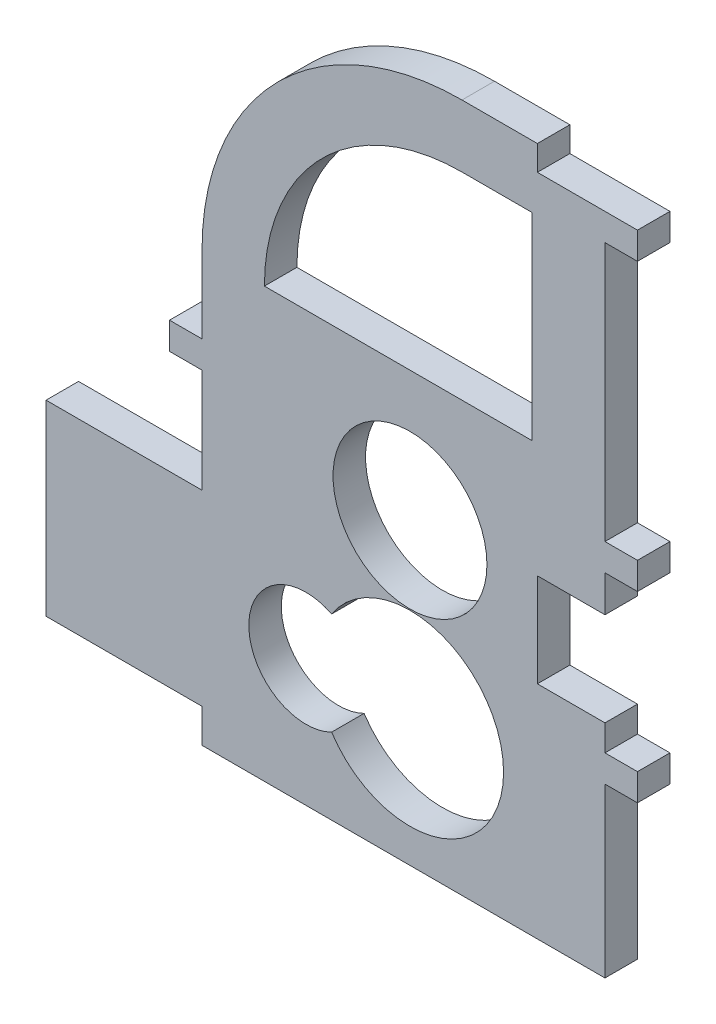
ISO-10303-21;
HEADER;
FILE_DESCRIPTION(('STEP AP214'),'2;1');
FILE_NAME('part.step','',(''),(''),'','','');
FILE_SCHEMA(('AUTOMOTIVE_DESIGN { 1 0 10303 214 1 1 1 1 }'));
ENDSEC;
DATA;
#1=APPLICATION_CONTEXT('core data for automotive mechanical design processes');
#2=APPLICATION_PROTOCOL_DEFINITION('international standard','automotive_design',2000,#1);
#3=PRODUCT_CONTEXT('',#1,'mechanical');
#4=PRODUCT('Part','Part','',(#3));
#5=PRODUCT_RELATED_PRODUCT_CATEGORY('part','',(#4));
#6=PRODUCT_DEFINITION_FORMATION('','',#4);
#7=PRODUCT_DEFINITION_CONTEXT('part definition',#1,'design');
#8=PRODUCT_DEFINITION('design','',#6,#7);
#9=PRODUCT_DEFINITION_SHAPE('','',#8);
#10=(LENGTH_UNIT() NAMED_UNIT(*) SI_UNIT(.MILLI.,.METRE.));
#11=(NAMED_UNIT(*) PLANE_ANGLE_UNIT() SI_UNIT($,.RADIAN.));
#12=(NAMED_UNIT(*) SI_UNIT($,.STERADIAN.) SOLID_ANGLE_UNIT());
#13=UNCERTAINTY_MEASURE_WITH_UNIT(LENGTH_MEASURE(1.E-05),#10,'distance_accuracy_value','');
#14=(GEOMETRIC_REPRESENTATION_CONTEXT(3) GLOBAL_UNCERTAINTY_ASSIGNED_CONTEXT((#13)) GLOBAL_UNIT_ASSIGNED_CONTEXT((#10,
#11,#12)) REPRESENTATION_CONTEXT('',''));
#15=CARTESIAN_POINT('',(0.,0.,0.));
#16=DIRECTION('',(0.,0.,1.));
#17=DIRECTION('',(1.,0.,0.));
#18=AXIS2_PLACEMENT_3D('',#15,#16,#17);
#19=CARTESIAN_POINT('',(0.,0.,1.5875));
#20=DIRECTION('',(0.,0.,1.));
#21=DIRECTION('',(1.,0.,0.));
#22=AXIS2_PLACEMENT_3D('',#19,#20,#21);
#23=PLANE('',#22);
#24=CARTESIAN_POINT('',(2.53999999958048,6.34999999999666,1.5875));
#25=DIRECTION('',(0.,0.,1.));
#26=DIRECTION('',(1.,0.,0.));
#27=AXIS2_PLACEMENT_3D('',#24,#25,#26);
#28=CIRCLE('',#27,9.652);
#29=CARTESIAN_POINT('',(2.53999999958048,16.0019999999967,1.5875));
#30=VERTEX_POINT('',#29);
#31=CARTESIAN_POINT('',(-7.11200000041952,6.34999999999666,1.5875));
#32=VERTEX_POINT('',#31);
#33=EDGE_CURVE('E340',#30,#32,#28,.T.);
#34=ORIENTED_EDGE('',*,*,#33,.F.);
#35=DIRECTION('',(-1.,0.,0.));
#36=VECTOR('',#35,1.);
#37=CARTESIAN_POINT('',(0.,16.0019999999967,1.5875));
#38=LINE('',#37,#36);
#39=CARTESIAN_POINT('',(5.96899999916794,16.0019999999967,1.5875));
#40=VERTEX_POINT('',#39);
#41=EDGE_CURVE('E337',#40,#30,#38,.T.);
#42=ORIENTED_EDGE('',*,*,#41,.F.);
#43=DIRECTION('',(0.,1.,0.));
#44=VECTOR('',#43,1.);
#45=CARTESIAN_POINT('',(5.96899999916794,0.,1.5875));
#46=LINE('',#45,#44);
#47=CARTESIAN_POINT('',(5.96899999916794,6.34999999999666,1.5875));
#48=VERTEX_POINT('',#47);
#49=EDGE_CURVE('E334',#48,#40,#46,.T.);
#50=ORIENTED_EDGE('',*,*,#49,.F.);
#51=DIRECTION('',(1.,0.,0.));
#52=VECTOR('',#51,1.);
#53=CARTESIAN_POINT('',(0.,6.34999999999666,1.5875));
#54=LINE('',#53,#52);
#55=EDGE_CURVE('E331',#32,#48,#54,.T.);
#56=ORIENTED_EDGE('',*,*,#55,.F.);
#57=EDGE_LOOP('',(#34,#42,#50,#56));
#58=FACE_BOUND('',#57,.T.);
#59=CARTESIAN_POINT('',(0.,0.,1.5875));
#60=DIRECTION('',(0.,0.,1.));
#61=DIRECTION('',(1.,0.,0.));
#62=AXIS2_PLACEMENT_3D('',#59,#60,#61);
#63=CIRCLE('',#62,3.7592);
#64=CARTESIAN_POINT('',(3.7592,0.,1.5875));
#65=VERTEX_POINT('',#64);
#66=EDGE_CURVE('E328',#65,#65,#63,.T.);
#67=ORIENTED_EDGE('',*,*,#66,.F.);
#68=EDGE_LOOP('',(#67));
#69=FACE_BOUND('',#68,.T.);
#70=CARTESIAN_POINT('',(-5.08,-8.382,1.5875));
#71=DIRECTION('',(0.,0.,1.));
#72=DIRECTION('',(1.,0.,0.));
#73=AXIS2_PLACEMENT_3D('',#70,#71,#72);
#74=CIRCLE('',#73,2.794);
#75=CARTESIAN_POINT('',(-3.82905,-5.88368855074072,1.5875));
#76=VERTEX_POINT('',#75);
#77=CARTESIAN_POINT('',(-3.82905,-10.8803114492593,1.5875));
#78=VERTEX_POINT('',#77);
#79=EDGE_CURVE('E325',#76,#78,#74,.T.);
#80=ORIENTED_EDGE('',*,*,#79,.F.);
#81=CARTESIAN_POINT('',(0.,-8.382,1.5875));
#82=DIRECTION('',(0.,0.,1.));
#83=DIRECTION('',(1.,0.,0.));
#84=AXIS2_PLACEMENT_3D('',#81,#82,#83);
#85=CIRCLE('',#84,4.572);
#86=EDGE_CURVE('E322',#78,#76,#85,.T.);
#87=ORIENTED_EDGE('',*,*,#86,.F.);
#88=EDGE_LOOP('',(#80,#87));
#89=FACE_BOUND('',#88,.T.);
#90=DIRECTION('',(1.,0.,0.));
#91=VECTOR('',#90,1.);
#92=CARTESIAN_POINT('',(0.,17.8308,1.5875));
#93=LINE('',#92,#91);
#94=CARTESIAN_POINT('',(6.222999999168,17.8308,1.5875));
#95=VERTEX_POINT('',#94);
#96=CARTESIAN_POINT('',(11.1124999991679,17.8308,1.5875));
#97=VERTEX_POINT('',#96);
#98=EDGE_CURVE('E408',#95,#97,#93,.T.);
#99=ORIENTED_EDGE('',*,*,#98,.F.);
#100=DIRECTION('',(0.,1.,0.));
#101=VECTOR('',#100,1.);
#102=CARTESIAN_POINT('',(6.22299999916801,0.,1.5875));
#103=LINE('',#102,#101);
#104=CARTESIAN_POINT('',(6.222999999168,19.0499999999967,1.5875));
#105=VERTEX_POINT('',#104);
#106=EDGE_CURVE('E374',#95,#105,#103,.T.);
#107=ORIENTED_EDGE('',*,*,#106,.T.);
#108=DIRECTION('',(1.,0.,0.));
#109=VECTOR('',#108,1.);
#110=CARTESIAN_POINT('',(0.,19.0499999999967,1.5875));
#111=LINE('',#110,#109);
#112=CARTESIAN_POINT('',(2.53999999958048,19.0499999999967,1.5875));
#113=VERTEX_POINT('',#112);
#114=EDGE_CURVE('E319',#113,#105,#111,.T.);
#115=ORIENTED_EDGE('',*,*,#114,.F.);
#116=CARTESIAN_POINT('',(2.53999999958048,6.34999999999666,1.5875));
#117=DIRECTION('',(0.,0.,1.));
#118=DIRECTION('',(1.,0.,0.));
#119=AXIS2_PLACEMENT_3D('',#116,#117,#118);
#120=CIRCLE('',#119,12.7);
#121=CARTESIAN_POINT('',(-10.1600000004195,6.34999999999665,1.5875));
#122=VERTEX_POINT('',#121);
#123=EDGE_CURVE('E317',#113,#122,#120,.T.);
#124=ORIENTED_EDGE('',*,*,#123,.T.);
#125=DIRECTION('',(1.96865244750783E-11,1.,0.));
#126=VECTOR('',#125,1.);
#127=CARTESIAN_POINT('',(-10.1600000005445,2.00015088677516E-10,1.5875));
#128=LINE('',#127,#126);
#129=CARTESIAN_POINT('',(-10.1600000004935,2.5908,1.5875));
#130=VERTEX_POINT('',#129);
#131=EDGE_CURVE('E299',#130,#122,#128,.T.);
#132=ORIENTED_EDGE('',*,*,#131,.F.);
#133=DIRECTION('',(1.,0.,0.));
#134=VECTOR('',#133,1.);
#135=CARTESIAN_POINT('',(0.,2.5908,1.5875));
#136=LINE('',#135,#134);
#137=CARTESIAN_POINT('',(-11.7475000008321,2.5908,1.5875));
#138=VERTEX_POINT('',#137);
#139=EDGE_CURVE('E313',#138,#130,#136,.T.);
#140=ORIENTED_EDGE('',*,*,#139,.F.);
#141=DIRECTION('',(0.,1.,0.));
#142=VECTOR('',#141,1.);
#143=CARTESIAN_POINT('',(-11.7475000008321,0.,1.5875));
#144=LINE('',#143,#142);
#145=CARTESIAN_POINT('',(-11.7475000008321,1.27,1.5875));
#146=VERTEX_POINT('',#145);
#147=EDGE_CURVE('E310',#146,#138,#144,.T.);
#148=ORIENTED_EDGE('',*,*,#147,.F.);
#149=DIRECTION('',(1.,0.,0.));
#150=VECTOR('',#149,1.);
#151=CARTESIAN_POINT('',(0.,1.26999999999999,1.5875));
#152=LINE('',#151,#150);
#153=CARTESIAN_POINT('',(-10.1600000005195,1.27,1.5875));
#154=VERTEX_POINT('',#153);
#155=EDGE_CURVE('E308',#146,#154,#152,.T.);
#156=ORIENTED_EDGE('',*,*,#155,.T.);
#157=CARTESIAN_POINT('',(-10.1600000006195,-3.80999999999956,1.5875));
#158=VERTEX_POINT('',#157);
#159=EDGE_CURVE('E298',#158,#154,#128,.T.);
#160=ORIENTED_EDGE('',*,*,#159,.F.);
#161=DIRECTION('',(-1.,0.,0.));
#162=VECTOR('',#161,1.);
#163=CARTESIAN_POINT('',(0.,-3.80999999999956,1.5875));
#164=LINE('',#163,#162);
#165=CARTESIAN_POINT('',(-17.7800000004195,-3.80999999999956,1.5875));
#166=VERTEX_POINT('',#165);
#167=EDGE_CURVE('E306',#158,#166,#164,.T.);
#168=ORIENTED_EDGE('',*,*,#167,.T.);
#169=DIRECTION('',(0.,1.,0.));
#170=VECTOR('',#169,1.);
#171=CARTESIAN_POINT('',(-17.7800000004195,0.,1.5875));
#172=LINE('',#171,#170);
#173=CARTESIAN_POINT('',(-17.7800000004195,-12.9539999999996,1.5875));
#174=VERTEX_POINT('',#173);
#175=EDGE_CURVE('E303',#174,#166,#172,.T.);
#176=ORIENTED_EDGE('',*,*,#175,.F.);
#177=DIRECTION('',(-1.,0.,0.));
#178=VECTOR('',#177,1.);
#179=CARTESIAN_POINT('',(0.,-12.9539999999996,1.5875));
#180=LINE('',#179,#178);
#181=CARTESIAN_POINT('',(-10.1600000007995,-12.9539999999996,1.5875));
#182=VERTEX_POINT('',#181);
#183=EDGE_CURVE('E296',#182,#174,#180,.T.);
#184=ORIENTED_EDGE('',*,*,#183,.F.);
#185=CARTESIAN_POINT('',(-10.1600000008321,-14.6049999999945,1.5875));
#186=VERTEX_POINT('',#185);
#187=EDGE_CURVE('E292',#186,#182,#128,.T.);
#188=ORIENTED_EDGE('',*,*,#187,.F.);
#189=DIRECTION('',(-1.,0.,0.));
#190=VECTOR('',#189,1.);
#191=CARTESIAN_POINT('',(0.,-14.6049999999945,1.5875));
#192=LINE('',#191,#190);
#193=CARTESIAN_POINT('',(9.52499999916795,-14.6049999999945,1.5875));
#194=VERTEX_POINT('',#193);
#195=EDGE_CURVE('E287',#194,#186,#192,.T.);
#196=ORIENTED_EDGE('',*,*,#195,.F.);
#197=DIRECTION('',(0.,-1.,0.));
#198=VECTOR('',#197,1.);
#199=CARTESIAN_POINT('',(9.52499999916797,0.,1.5875));
#200=LINE('',#199,#198);
#201=CARTESIAN_POINT('',(9.52499999916796,-6.4008,1.5875));
#202=VERTEX_POINT('',#201);
#203=EDGE_CURVE('E271',#202,#194,#200,.T.);
#204=ORIENTED_EDGE('',*,*,#203,.F.);
#205=DIRECTION('',(1.,0.,0.));
#206=VECTOR('',#205,1.);
#207=CARTESIAN_POINT('',(0.,-6.4008,1.5875));
#208=LINE('',#207,#206);
#209=CARTESIAN_POINT('',(11.1124999991679,-6.4008,1.5875));
#210=VERTEX_POINT('',#209);
#211=EDGE_CURVE('E286',#202,#210,#208,.T.);
#212=ORIENTED_EDGE('',*,*,#211,.T.);
#213=DIRECTION('',(0.,1.,0.));
#214=VECTOR('',#213,1.);
#215=CARTESIAN_POINT('',(11.1124999991679,0.,1.5875));
#216=LINE('',#215,#214);
#217=CARTESIAN_POINT('',(11.1124999991679,-5.08,1.5875));
#218=VERTEX_POINT('',#217);
#219=EDGE_CURVE('E283',#210,#218,#216,.T.);
#220=ORIENTED_EDGE('',*,*,#219,.T.);
#221=DIRECTION('',(1.,0.,0.));
#222=VECTOR('',#221,1.);
#223=CARTESIAN_POINT('',(0.,-5.07999999999999,1.5875));
#224=LINE('',#223,#222);
#225=CARTESIAN_POINT('',(9.52499999916797,-5.08,1.5875));
#226=VERTEX_POINT('',#225);
#227=EDGE_CURVE('E276',#226,#218,#224,.T.);
#228=ORIENTED_EDGE('',*,*,#227,.F.);
#229=CARTESIAN_POINT('',(9.52499999916797,-3.81,1.5875));
#230=VERTEX_POINT('',#229);
#231=EDGE_CURVE('E268',#230,#226,#200,.T.);
#232=ORIENTED_EDGE('',*,*,#231,.F.);
#233=DIRECTION('',(1.,0.,0.));
#234=VECTOR('',#233,1.);
#235=CARTESIAN_POINT('',(0.,-3.81,1.5875));
#236=LINE('',#235,#234);
#237=CARTESIAN_POINT('',(6.22299999916798,-3.81,1.5875));
#238=VERTEX_POINT('',#237);
#239=EDGE_CURVE('E351',#238,#230,#236,.T.);
#240=ORIENTED_EDGE('',*,*,#239,.F.);
#241=DIRECTION('',(0.,1.,0.));
#242=VECTOR('',#241,1.);
#243=CARTESIAN_POINT('',(6.22299999916798,0.,1.5875));
#244=LINE('',#243,#242);
#245=CARTESIAN_POINT('',(6.22299999916798,0.762,1.5875));
#246=VERTEX_POINT('',#245);
#247=EDGE_CURVE('E359',#238,#246,#244,.T.);
#248=ORIENTED_EDGE('',*,*,#247,.T.);
#249=DIRECTION('',(1.,0.,0.));
#250=VECTOR('',#249,1.);
#251=CARTESIAN_POINT('',(0.,0.762,1.5875));
#252=LINE('',#251,#250);
#253=CARTESIAN_POINT('',(9.52499999916797,0.762,1.5875));
#254=VERTEX_POINT('',#253);
#255=EDGE_CURVE('E362',#246,#254,#252,.T.);
#256=ORIENTED_EDGE('',*,*,#255,.T.);
#257=CARTESIAN_POINT('',(9.52499999916798,2.54,1.5875));
#258=VERTEX_POINT('',#257);
#259=EDGE_CURVE('E267',#258,#254,#200,.T.);
#260=ORIENTED_EDGE('',*,*,#259,.F.);
#261=DIRECTION('',(1.,0.,0.));
#262=VECTOR('',#261,1.);
#263=CARTESIAN_POINT('',(0.,2.54,1.5875));
#264=LINE('',#263,#262);
#265=CARTESIAN_POINT('',(11.1124999995805,2.54,1.5875));
#266=VERTEX_POINT('',#265);
#267=EDGE_CURVE('E275',#258,#266,#264,.T.);
#268=ORIENTED_EDGE('',*,*,#267,.T.);
#269=DIRECTION('',(0.,1.,0.));
#270=VECTOR('',#269,1.);
#271=CARTESIAN_POINT('',(11.1124999995805,0.,1.5875));
#272=LINE('',#271,#270);
#273=CARTESIAN_POINT('',(11.1124999995805,3.8608,1.5875));
#274=VERTEX_POINT('',#273);
#275=EDGE_CURVE('E269',#266,#274,#272,.T.);
#276=ORIENTED_EDGE('',*,*,#275,.T.);
#277=DIRECTION('',(1.,0.,0.));
#278=VECTOR('',#277,1.);
#279=CARTESIAN_POINT('',(0.,3.8608,1.5875));
#280=LINE('',#279,#278);
#281=CARTESIAN_POINT('',(9.52499999916798,3.8608,1.5875));
#282=VERTEX_POINT('',#281);
#283=EDGE_CURVE('E265',#282,#274,#280,.T.);
#284=ORIENTED_EDGE('',*,*,#283,.F.);
#285=CARTESIAN_POINT('',(9.52499999916794,16.51,1.5875));
#286=VERTEX_POINT('',#285);
#287=EDGE_CURVE('E249',#286,#282,#200,.T.);
#288=ORIENTED_EDGE('',*,*,#287,.F.);
#289=DIRECTION('',(1.,0.,0.));
#290=VECTOR('',#289,1.);
#291=CARTESIAN_POINT('',(0.,16.51,1.5875));
#292=LINE('',#291,#290);
#293=CARTESIAN_POINT('',(11.1124999991679,16.51,1.5875));
#294=VERTEX_POINT('',#293);
#295=EDGE_CURVE('E259',#286,#294,#292,.T.);
#296=ORIENTED_EDGE('',*,*,#295,.T.);
#297=DIRECTION('',(0.,1.,0.));
#298=VECTOR('',#297,1.);
#299=CARTESIAN_POINT('',(11.1124999991679,0.,1.5875));
#300=LINE('',#299,#298);
#301=EDGE_CURVE('E61',#294,#97,#300,.T.);
#302=ORIENTED_EDGE('',*,*,#301,.T.);
#303=EDGE_LOOP('',(#99,#107,#115,#124,#132,#140,#148,#156,#160,#168,#176,#184,#188,#196,#204,
#212,#220,#228,#232,#240,#248,#256,#260,#268,#276,#284,#288,#296,#302));
#304=FACE_BOUND('',#303,.T.);
#305=ADVANCED_FACE('F35',(#58,#69,#89,#304),#23,.T.);
#306=CARTESIAN_POINT('',(0.,0.,0.));
#307=DIRECTION('',(0.,0.,1.));
#308=DIRECTION('',(1.,0.,0.));
#309=AXIS2_PLACEMENT_3D('',#306,#307,#308);
#310=PLANE('',#309);
#311=CARTESIAN_POINT('',(2.53999999958048,6.34999999999666,0.));
#312=DIRECTION('',(0.,0.,1.));
#313=DIRECTION('',(1.,0.,0.));
#314=AXIS2_PLACEMENT_3D('',#311,#312,#313);
#315=CIRCLE('',#314,9.652);
#316=CARTESIAN_POINT('',(2.53999999958048,16.0019999999967,0.));
#317=VERTEX_POINT('',#316);
#318=CARTESIAN_POINT('',(-7.11200000041952,6.34999999999666,0.));
#319=VERTEX_POINT('',#318);
#320=EDGE_CURVE('E346',#317,#319,#315,.T.);
#321=ORIENTED_EDGE('',*,*,#320,.T.);
#322=DIRECTION('',(1.,0.,0.));
#323=VECTOR('',#322,1.);
#324=CARTESIAN_POINT('',(0.,6.34999999999666,0.));
#325=LINE('',#324,#323);
#326=CARTESIAN_POINT('',(5.96899999916794,6.34999999999666,0.));
#327=VERTEX_POINT('',#326);
#328=EDGE_CURVE('E462',#319,#327,#325,.T.);
#329=ORIENTED_EDGE('',*,*,#328,.T.);
#330=DIRECTION('',(0.,1.,0.));
#331=VECTOR('',#330,1.);
#332=CARTESIAN_POINT('',(5.96899999916794,0.,0.));
#333=LINE('',#332,#331);
#334=CARTESIAN_POINT('',(5.96899999916794,16.0019999999967,0.));
#335=VERTEX_POINT('',#334);
#336=EDGE_CURVE('E459',#327,#335,#333,.T.);
#337=ORIENTED_EDGE('',*,*,#336,.T.);
#338=DIRECTION('',(-1.,0.,0.));
#339=VECTOR('',#338,1.);
#340=CARTESIAN_POINT('',(0.,16.0019999999967,0.));
#341=LINE('',#340,#339);
#342=EDGE_CURVE('E456',#335,#317,#341,.T.);
#343=ORIENTED_EDGE('',*,*,#342,.T.);
#344=EDGE_LOOP('',(#321,#329,#337,#343));
#345=FACE_BOUND('',#344,.T.);
#346=CARTESIAN_POINT('',(0.,0.,0.));
#347=DIRECTION('',(0.,0.,1.));
#348=DIRECTION('',(1.,0.,0.));
#349=AXIS2_PLACEMENT_3D('',#346,#347,#348);
#350=CIRCLE('',#349,3.7592);
#351=CARTESIAN_POINT('',(3.7592,0.,0.));
#352=VERTEX_POINT('',#351);
#353=EDGE_CURVE('E465',#352,#352,#350,.T.);
#354=ORIENTED_EDGE('',*,*,#353,.T.);
#355=EDGE_LOOP('',(#354));
#356=FACE_BOUND('',#355,.T.);
#357=CARTESIAN_POINT('',(-5.08,-8.382,0.));
#358=DIRECTION('',(0.,0.,1.));
#359=DIRECTION('',(1.,0.,0.));
#360=AXIS2_PLACEMENT_3D('',#357,#358,#359);
#361=CIRCLE('',#360,2.794);
#362=CARTESIAN_POINT('',(-3.82905,-5.88368855074072,0.));
#363=VERTEX_POINT('',#362);
#364=CARTESIAN_POINT('',(-3.82905,-10.8803114492593,0.));
#365=VERTEX_POINT('',#364);
#366=EDGE_CURVE('E468',#363,#365,#361,.T.);
#367=ORIENTED_EDGE('',*,*,#366,.T.);
#368=CARTESIAN_POINT('',(0.,-8.382,0.));
#369=DIRECTION('',(0.,0.,1.));
#370=DIRECTION('',(1.,0.,0.));
#371=AXIS2_PLACEMENT_3D('',#368,#369,#370);
#372=CIRCLE('',#371,4.572);
#373=EDGE_CURVE('E471',#365,#363,#372,.T.);
#374=ORIENTED_EDGE('',*,*,#373,.T.);
#375=EDGE_LOOP('',(#367,#374));
#376=FACE_BOUND('',#375,.T.);
#377=DIRECTION('',(0.,-1.,0.));
#378=VECTOR('',#377,1.);
#379=CARTESIAN_POINT('',(6.22299999916801,0.,0.));
#380=LINE('',#379,#378);
#381=CARTESIAN_POINT('',(6.222999999168,19.0499999999967,0.));
#382=VERTEX_POINT('',#381);
#383=CARTESIAN_POINT('',(6.222999999168,17.8308,0.));
#384=VERTEX_POINT('',#383);
#385=EDGE_CURVE('E379',#382,#384,#380,.T.);
#386=ORIENTED_EDGE('',*,*,#385,.T.);
#387=DIRECTION('',(1.,0.,0.));
#388=VECTOR('',#387,1.);
#389=CARTESIAN_POINT('',(0.,17.8308,0.));
#390=LINE('',#389,#388);
#391=CARTESIAN_POINT('',(11.1124999991679,17.8308,0.));
#392=VERTEX_POINT('',#391);
#393=EDGE_CURVE('E342',#384,#392,#390,.T.);
#394=ORIENTED_EDGE('',*,*,#393,.T.);
#395=DIRECTION('',(0.,1.,0.));
#396=VECTOR('',#395,1.);
#397=CARTESIAN_POINT('',(11.1124999991679,0.,0.));
#398=LINE('',#397,#396);
#399=CARTESIAN_POINT('',(11.1124999991679,16.51,0.));
#400=VERTEX_POINT('',#399);
#401=EDGE_CURVE('E527',#400,#392,#398,.T.);
#402=ORIENTED_EDGE('',*,*,#401,.F.);
#403=DIRECTION('',(1.,0.,0.));
#404=VECTOR('',#403,1.);
#405=CARTESIAN_POINT('',(0.,16.51,0.));
#406=LINE('',#405,#404);
#407=CARTESIAN_POINT('',(9.52499999916794,16.51,0.));
#408=VERTEX_POINT('',#407);
#409=EDGE_CURVE('E525',#408,#400,#406,.T.);
#410=ORIENTED_EDGE('',*,*,#409,.F.);
#411=DIRECTION('',(0.,-1.,0.));
#412=VECTOR('',#411,1.);
#413=CARTESIAN_POINT('',(9.52499999916797,0.,0.));
#414=LINE('',#413,#412);
#415=CARTESIAN_POINT('',(9.52499999916798,3.8608,0.));
#416=VERTEX_POINT('',#415);
#417=EDGE_CURVE('E251',#408,#416,#414,.T.);
#418=ORIENTED_EDGE('',*,*,#417,.T.);
#419=DIRECTION('',(1.,0.,0.));
#420=VECTOR('',#419,1.);
#421=CARTESIAN_POINT('',(0.,3.8608,0.));
#422=LINE('',#421,#420);
#423=CARTESIAN_POINT('',(11.1124999995805,3.8608,0.));
#424=VERTEX_POINT('',#423);
#425=EDGE_CURVE('E522',#416,#424,#422,.T.);
#426=ORIENTED_EDGE('',*,*,#425,.T.);
#427=DIRECTION('',(0.,1.,0.));
#428=VECTOR('',#427,1.);
#429=CARTESIAN_POINT('',(11.1124999995805,0.,0.));
#430=LINE('',#429,#428);
#431=CARTESIAN_POINT('',(11.1124999995805,2.54,0.));
#432=VERTEX_POINT('',#431);
#433=EDGE_CURVE('E519',#432,#424,#430,.T.);
#434=ORIENTED_EDGE('',*,*,#433,.F.);
#435=DIRECTION('',(1.,0.,0.));
#436=VECTOR('',#435,1.);
#437=CARTESIAN_POINT('',(0.,2.54,0.));
#438=LINE('',#437,#436);
#439=CARTESIAN_POINT('',(9.52499999916798,2.54,0.));
#440=VERTEX_POINT('',#439);
#441=EDGE_CURVE('E517',#440,#432,#438,.T.);
#442=ORIENTED_EDGE('',*,*,#441,.F.);
#443=CARTESIAN_POINT('',(9.52499999916797,0.762,0.));
#444=VERTEX_POINT('',#443);
#445=EDGE_CURVE('E437',#440,#444,#414,.T.);
#446=ORIENTED_EDGE('',*,*,#445,.T.);
#447=DIRECTION('',(-1.,0.,0.));
#448=VECTOR('',#447,1.);
#449=CARTESIAN_POINT('',(0.,0.762,0.));
#450=LINE('',#449,#448);
#451=CARTESIAN_POINT('',(6.22299999916798,0.762,0.));
#452=VERTEX_POINT('',#451);
#453=EDGE_CURVE('E365',#444,#452,#450,.T.);
#454=ORIENTED_EDGE('',*,*,#453,.T.);
#455=DIRECTION('',(0.,-1.,0.));
#456=VECTOR('',#455,1.);
#457=CARTESIAN_POINT('',(6.22299999916798,0.,0.));
#458=LINE('',#457,#456);
#459=CARTESIAN_POINT('',(6.22299999916798,-3.81,0.));
#460=VERTEX_POINT('',#459);
#461=EDGE_CURVE('E343',#452,#460,#458,.T.);
#462=ORIENTED_EDGE('',*,*,#461,.T.);
#463=DIRECTION('',(-1.,0.,0.));
#464=VECTOR('',#463,1.);
#465=CARTESIAN_POINT('',(0.,-3.81,0.));
#466=LINE('',#465,#464);
#467=CARTESIAN_POINT('',(9.52499999916797,-3.81,0.));
#468=VERTEX_POINT('',#467);
#469=EDGE_CURVE('E368',#468,#460,#466,.T.);
#470=ORIENTED_EDGE('',*,*,#469,.F.);
#471=CARTESIAN_POINT('',(9.52499999916797,-5.08,0.));
#472=VERTEX_POINT('',#471);
#473=EDGE_CURVE('E508',#468,#472,#414,.T.);
#474=ORIENTED_EDGE('',*,*,#473,.T.);
#475=DIRECTION('',(1.,0.,0.));
#476=VECTOR('',#475,1.);
#477=CARTESIAN_POINT('',(0.,-5.07999999999999,0.));
#478=LINE('',#477,#476);
#479=CARTESIAN_POINT('',(11.1124999991679,-5.08,0.));
#480=VERTEX_POINT('',#479);
#481=EDGE_CURVE('E514',#472,#480,#478,.T.);
#482=ORIENTED_EDGE('',*,*,#481,.T.);
#483=DIRECTION('',(0.,1.,0.));
#484=VECTOR('',#483,1.);
#485=CARTESIAN_POINT('',(11.1124999991679,0.,0.));
#486=LINE('',#485,#484);
#487=CARTESIAN_POINT('',(11.1124999991679,-6.4008,0.));
#488=VERTEX_POINT('',#487);
#489=EDGE_CURVE('E511',#488,#480,#486,.T.);
#490=ORIENTED_EDGE('',*,*,#489,.F.);
#491=DIRECTION('',(1.,0.,0.));
#492=VECTOR('',#491,1.);
#493=CARTESIAN_POINT('',(0.,-6.4008,0.));
#494=LINE('',#493,#492);
#495=CARTESIAN_POINT('',(9.52499999916796,-6.4008,0.));
#496=VERTEX_POINT('',#495);
#497=EDGE_CURVE('E507',#496,#488,#494,.T.);
#498=ORIENTED_EDGE('',*,*,#497,.F.);
#499=CARTESIAN_POINT('',(9.52499999916795,-14.6049999999945,0.));
#500=VERTEX_POINT('',#499);
#501=EDGE_CURVE('E504',#496,#500,#414,.T.);
#502=ORIENTED_EDGE('',*,*,#501,.T.);
#503=DIRECTION('',(-1.,0.,0.));
#504=VECTOR('',#503,1.);
#505=CARTESIAN_POINT('',(0.,-14.6049999999945,0.));
#506=LINE('',#505,#504);
#507=CARTESIAN_POINT('',(-10.1600000008321,-14.6049999999945,0.));
#508=VERTEX_POINT('',#507);
#509=EDGE_CURVE('E501',#500,#508,#506,.T.);
#510=ORIENTED_EDGE('',*,*,#509,.T.);
#511=DIRECTION('',(1.96865244750783E-11,1.,0.));
#512=VECTOR('',#511,1.);
#513=CARTESIAN_POINT('',(-10.1600000005445,2.00015088677516E-10,0.));
#514=LINE('',#513,#512);
#515=CARTESIAN_POINT('',(-10.1600000007995,-12.9539999999996,0.));
#516=VERTEX_POINT('',#515);
#517=EDGE_CURVE('E482',#508,#516,#514,.T.);
#518=ORIENTED_EDGE('',*,*,#517,.T.);
#519=DIRECTION('',(-1.,0.,0.));
#520=VECTOR('',#519,1.);
#521=CARTESIAN_POINT('',(0.,-12.9539999999996,0.));
#522=LINE('',#521,#520);
#523=CARTESIAN_POINT('',(-17.7800000004195,-12.9539999999996,0.));
#524=VERTEX_POINT('',#523);
#525=EDGE_CURVE('E498',#516,#524,#522,.T.);
#526=ORIENTED_EDGE('',*,*,#525,.T.);
#527=DIRECTION('',(0.,1.,0.));
#528=VECTOR('',#527,1.);
#529=CARTESIAN_POINT('',(-17.7800000004195,0.,0.));
#530=LINE('',#529,#528);
#531=CARTESIAN_POINT('',(-17.7800000004195,-3.80999999999956,0.));
#532=VERTEX_POINT('',#531);
#533=EDGE_CURVE('E495',#524,#532,#530,.T.);
#534=ORIENTED_EDGE('',*,*,#533,.T.);
#535=DIRECTION('',(-1.,0.,0.));
#536=VECTOR('',#535,1.);
#537=CARTESIAN_POINT('',(0.,-3.80999999999956,0.));
#538=LINE('',#537,#536);
#539=CARTESIAN_POINT('',(-10.1600000006195,-3.80999999999956,0.));
#540=VERTEX_POINT('',#539);
#541=EDGE_CURVE('E492',#540,#532,#538,.T.);
#542=ORIENTED_EDGE('',*,*,#541,.F.);
#543=CARTESIAN_POINT('',(-10.1600000005195,1.27,0.));
#544=VERTEX_POINT('',#543);
#545=EDGE_CURVE('E483',#540,#544,#514,.T.);
#546=ORIENTED_EDGE('',*,*,#545,.T.);
#547=DIRECTION('',(1.,0.,0.));
#548=VECTOR('',#547,1.);
#549=CARTESIAN_POINT('',(0.,1.26999999999999,0.));
#550=LINE('',#549,#548);
#551=CARTESIAN_POINT('',(-11.7475000008321,1.27,0.));
#552=VERTEX_POINT('',#551);
#553=EDGE_CURVE('E489',#552,#544,#550,.T.);
#554=ORIENTED_EDGE('',*,*,#553,.F.);
#555=DIRECTION('',(0.,1.,0.));
#556=VECTOR('',#555,1.);
#557=CARTESIAN_POINT('',(-11.7475000008321,0.,0.));
#558=LINE('',#557,#556);
#559=CARTESIAN_POINT('',(-11.7475000008321,2.5908,0.));
#560=VERTEX_POINT('',#559);
#561=EDGE_CURVE('E486',#552,#560,#558,.T.);
#562=ORIENTED_EDGE('',*,*,#561,.T.);
#563=DIRECTION('',(1.,0.,0.));
#564=VECTOR('',#563,1.);
#565=CARTESIAN_POINT('',(0.,2.5908,0.));
#566=LINE('',#565,#564);
#567=CARTESIAN_POINT('',(-10.1600000004935,2.5908,0.));
#568=VERTEX_POINT('',#567);
#569=EDGE_CURVE('E481',#560,#568,#566,.T.);
#570=ORIENTED_EDGE('',*,*,#569,.T.);
#571=CARTESIAN_POINT('',(-10.1600000004195,6.34999999999665,0.));
#572=VERTEX_POINT('',#571);
#573=EDGE_CURVE('E478',#568,#572,#514,.T.);
#574=ORIENTED_EDGE('',*,*,#573,.T.);
#575=CARTESIAN_POINT('',(2.53999999958048,6.34999999999666,0.));
#576=DIRECTION('',(0.,0.,1.));
#577=DIRECTION('',(1.,0.,0.));
#578=AXIS2_PLACEMENT_3D('',#575,#576,#577);
#579=CIRCLE('',#578,12.7);
#580=CARTESIAN_POINT('',(2.53999999958048,19.0499999999967,0.));
#581=VERTEX_POINT('',#580);
#582=EDGE_CURVE('E475',#581,#572,#579,.T.);
#583=ORIENTED_EDGE('',*,*,#582,.F.);
#584=DIRECTION('',(1.,0.,0.));
#585=VECTOR('',#584,1.);
#586=CARTESIAN_POINT('',(0.,19.0499999999967,0.));
#587=LINE('',#586,#585);
#588=EDGE_CURVE('E390',#581,#382,#587,.T.);
#589=ORIENTED_EDGE('',*,*,#588,.T.);
#590=EDGE_LOOP('',(#386,#394,#402,#410,#418,#426,#434,#442,#446,#454,#462,#470,#474,#482,#490,
#498,#502,#510,#518,#526,#534,#542,#546,#554,#562,#570,#574,#583,#589));
#591=FACE_BOUND('',#590,.T.);
#592=ADVANCED_FACE('F386',(#345,#356,#376,#591),#310,.F.);
#593=CARTESIAN_POINT('',(0.,19.0499999999967,1.5875));
#594=DIRECTION('',(0.,1.,0.));
#595=DIRECTION('',(0.,0.,1.));
#596=AXIS2_PLACEMENT_3D('',#593,#594,#595);
#597=PLANE('',#596);
#598=ORIENTED_EDGE('',*,*,#114,.T.);
#599=DIRECTION('',(0.,0.,1.));
#600=VECTOR('',#599,1.);
#601=CARTESIAN_POINT('',(6.222999999168,19.0499999999967,-0.000999999999999916));
#602=LINE('',#601,#600);
#603=EDGE_CURVE('E370',#382,#105,#602,.T.);
#604=ORIENTED_EDGE('',*,*,#603,.F.);
#605=ORIENTED_EDGE('',*,*,#588,.F.);
#606=DIRECTION('',(0.,0.,-1.));
#607=VECTOR('',#606,1.);
#608=CARTESIAN_POINT('',(2.53999999958048,19.0499999999967,1.5875));
#609=LINE('',#608,#607);
#610=EDGE_CURVE('E11',#113,#581,#609,.T.);
#611=ORIENTED_EDGE('',*,*,#610,.F.);
#612=EDGE_LOOP('',(#598,#604,#605,#611));
#613=FACE_BOUND('',#612,.T.);
#614=ADVANCED_FACE('F402',(#613),#597,.T.);
#615=CARTESIAN_POINT('',(9.52499999916797,0.,1.5875));
#616=DIRECTION('',(1.,0.,0.));
#617=DIRECTION('',(0.,1.,0.));
#618=AXIS2_PLACEMENT_3D('',#615,#616,#617);
#619=PLANE('',#618);
#620=ORIENTED_EDGE('',*,*,#259,.T.);
#621=DIRECTION('',(0.,0.,1.));
#622=VECTOR('',#621,1.);
#623=CARTESIAN_POINT('',(9.52499999916797,0.762,-0.000999999999999916));
#624=LINE('',#623,#622);
#625=EDGE_CURVE('E347',#444,#254,#624,.T.);
#626=ORIENTED_EDGE('',*,*,#625,.F.);
#627=ORIENTED_EDGE('',*,*,#445,.F.);
#628=DIRECTION('',(0.,0.,-1.));
#629=VECTOR('',#628,1.);
#630=CARTESIAN_POINT('',(9.52499999916798,2.54,1.5875));
#631=LINE('',#630,#629);
#632=EDGE_CURVE('E435',#258,#440,#631,.T.);
#633=ORIENTED_EDGE('',*,*,#632,.F.);
#634=EDGE_LOOP('',(#620,#626,#627,#633));
#635=FACE_BOUND('',#634,.T.);
#636=ADVANCED_FACE('F434',(#635),#619,.T.);
#637=CARTESIAN_POINT('',(2.53999999958048,6.34999999999666,1.5875));
#638=DIRECTION('',(0.,0.,-1.));
#639=DIRECTION('',(-1.,0.,0.));
#640=AXIS2_PLACEMENT_3D('',#637,#638,#639);
#641=CYLINDRICAL_SURFACE('',#640,12.7);
#642=ORIENTED_EDGE('',*,*,#582,.T.);
#643=DIRECTION('',(0.,0.,-1.));
#644=VECTOR('',#643,1.);
#645=CARTESIAN_POINT('',(-10.1600000004195,6.34999999999665,1.5875));
#646=LINE('',#645,#644);
#647=EDGE_CURVE('E44',#122,#572,#646,.T.);
#648=ORIENTED_EDGE('',*,*,#647,.F.);
#649=ORIENTED_EDGE('',*,*,#123,.F.);
#650=ORIENTED_EDGE('',*,*,#610,.T.);
#651=EDGE_LOOP('',(#642,#648,#649,#650));
#652=FACE_BOUND('',#651,.T.);
#653=ADVANCED_FACE('F611',(#652),#641,.T.);
#654=CARTESIAN_POINT('',(-10.1600000005445,2.00015088677516E-10,1.5875));
#655=DIRECTION('',(-1.,1.96865244750783E-11,0.));
#656=DIRECTION('',(-1.96865244750783E-11,-1.,0.));
#657=AXIS2_PLACEMENT_3D('',#654,#655,#656);
#658=PLANE('',#657);
#659=ORIENTED_EDGE('',*,*,#573,.F.);
#660=DIRECTION('',(0.,0.,-1.));
#661=VECTOR('',#660,1.);
#662=CARTESIAN_POINT('',(-10.1600000004935,2.5908,1.5875));
#663=LINE('',#662,#661);
#664=EDGE_CURVE('E563',#130,#568,#663,.T.);
#665=ORIENTED_EDGE('',*,*,#664,.F.);
#666=ORIENTED_EDGE('',*,*,#131,.T.);
#667=ORIENTED_EDGE('',*,*,#647,.T.);
#668=EDGE_LOOP('',(#659,#665,#666,#667));
#669=FACE_BOUND('',#668,.T.);
#670=ADVANCED_FACE('F654',(#669),#658,.T.);
#671=CARTESIAN_POINT('',(0.,2.5908,1.5875));
#672=DIRECTION('',(0.,1.,0.));
#673=DIRECTION('',(0.,0.,1.));
#674=AXIS2_PLACEMENT_3D('',#671,#672,#673);
#675=PLANE('',#674);
#676=ORIENTED_EDGE('',*,*,#569,.F.);
#677=DIRECTION('',(0.,0.,-1.));
#678=VECTOR('',#677,1.);
#679=CARTESIAN_POINT('',(-11.7475000008321,2.5908,1.5875));
#680=LINE('',#679,#678);
#681=EDGE_CURVE('E561',#138,#560,#680,.T.);
#682=ORIENTED_EDGE('',*,*,#681,.F.);
#683=ORIENTED_EDGE('',*,*,#139,.T.);
#684=ORIENTED_EDGE('',*,*,#664,.T.);
#685=EDGE_LOOP('',(#676,#682,#683,#684));
#686=FACE_BOUND('',#685,.T.);
#687=ADVANCED_FACE('F674',(#686),#675,.T.);
#688=CARTESIAN_POINT('',(-11.7475000008321,0.,1.5875));
#689=DIRECTION('',(-1.,0.,0.));
#690=DIRECTION('',(0.,-1.,0.));
#691=AXIS2_PLACEMENT_3D('',#688,#689,#690);
#692=PLANE('',#691);
#693=ORIENTED_EDGE('',*,*,#561,.F.);
#694=DIRECTION('',(0.,0.,-1.));
#695=VECTOR('',#694,1.);
#696=CARTESIAN_POINT('',(-11.7475000008321,1.27,1.5875));
#697=LINE('',#696,#695);
#698=EDGE_CURVE('E559',#146,#552,#697,.T.);
#699=ORIENTED_EDGE('',*,*,#698,.F.);
#700=ORIENTED_EDGE('',*,*,#147,.T.);
#701=ORIENTED_EDGE('',*,*,#681,.T.);
#702=EDGE_LOOP('',(#693,#699,#700,#701));
#703=FACE_BOUND('',#702,.T.);
#704=ADVANCED_FACE('F670',(#703),#692,.T.);
#705=CARTESIAN_POINT('',(0.,1.26999999999999,1.5875));
#706=DIRECTION('',(0.,1.,0.));
#707=DIRECTION('',(-1.,0.,0.));
#708=AXIS2_PLACEMENT_3D('',#705,#706,#707);
#709=PLANE('',#708);
#710=ORIENTED_EDGE('',*,*,#553,.T.);
#711=DIRECTION('',(0.,0.,-1.));
#712=VECTOR('',#711,1.);
#713=CARTESIAN_POINT('',(-10.1600000005195,1.27,1.5875));
#714=LINE('',#713,#712);
#715=EDGE_CURVE('E557',#154,#544,#714,.T.);
#716=ORIENTED_EDGE('',*,*,#715,.F.);
#717=ORIENTED_EDGE('',*,*,#155,.F.);
#718=ORIENTED_EDGE('',*,*,#698,.T.);
#719=EDGE_LOOP('',(#710,#716,#717,#718));
#720=FACE_BOUND('',#719,.T.);
#721=ADVANCED_FACE('F667',(#720),#709,.F.);
#722=ORIENTED_EDGE('',*,*,#545,.F.);
#723=DIRECTION('',(0.,0.,-1.));
#724=VECTOR('',#723,1.);
#725=CARTESIAN_POINT('',(-10.1600000006195,-3.80999999999956,1.5875));
#726=LINE('',#725,#724);
#727=EDGE_CURVE('E555',#158,#540,#726,.T.);
#728=ORIENTED_EDGE('',*,*,#727,.F.);
#729=ORIENTED_EDGE('',*,*,#159,.T.);
#730=ORIENTED_EDGE('',*,*,#715,.T.);
#731=EDGE_LOOP('',(#722,#728,#729,#730));
#732=FACE_BOUND('',#731,.T.);
#733=ADVANCED_FACE('F655',(#732),#658,.T.);
#734=CARTESIAN_POINT('',(0.,-3.80999999999956,1.5875));
#735=DIRECTION('',(0.,-1.,0.));
#736=DIRECTION('',(1.,0.,0.));
#737=AXIS2_PLACEMENT_3D('',#734,#735,#736);
#738=PLANE('',#737);
#739=ORIENTED_EDGE('',*,*,#541,.T.);
#740=DIRECTION('',(0.,0.,-1.));
#741=VECTOR('',#740,1.);
#742=CARTESIAN_POINT('',(-17.7800000004195,-3.80999999999956,1.5875));
#743=LINE('',#742,#741);
#744=EDGE_CURVE('E553',#166,#532,#743,.T.);
#745=ORIENTED_EDGE('',*,*,#744,.F.);
#746=ORIENTED_EDGE('',*,*,#167,.F.);
#747=ORIENTED_EDGE('',*,*,#727,.T.);
#748=EDGE_LOOP('',(#739,#745,#746,#747));
#749=FACE_BOUND('',#748,.T.);
#750=ADVANCED_FACE('F662',(#749),#738,.F.);
#751=CARTESIAN_POINT('',(-17.7800000004195,0.,1.5875));
#752=DIRECTION('',(-1.,0.,0.));
#753=DIRECTION('',(0.,0.,1.));
#754=AXIS2_PLACEMENT_3D('',#751,#752,#753);
#755=PLANE('',#754);
#756=ORIENTED_EDGE('',*,*,#533,.F.);
#757=DIRECTION('',(0.,0.,-1.));
#758=VECTOR('',#757,1.);
#759=CARTESIAN_POINT('',(-17.7800000004195,-12.9539999999996,1.5875));
#760=LINE('',#759,#758);
#761=EDGE_CURVE('E551',#174,#524,#760,.T.);
#762=ORIENTED_EDGE('',*,*,#761,.F.);
#763=ORIENTED_EDGE('',*,*,#175,.T.);
#764=ORIENTED_EDGE('',*,*,#744,.T.);
#765=EDGE_LOOP('',(#756,#762,#763,#764));
#766=FACE_BOUND('',#765,.T.);
#767=ADVANCED_FACE('F658',(#766),#755,.T.);
#768=CARTESIAN_POINT('',(0.,-12.9539999999996,1.5875));
#769=DIRECTION('',(0.,-1.,0.));
#770=DIRECTION('',(0.,0.,-1.));
#771=AXIS2_PLACEMENT_3D('',#768,#769,#770);
#772=PLANE('',#771);
#773=ORIENTED_EDGE('',*,*,#525,.F.);
#774=DIRECTION('',(0.,0.,-1.));
#775=VECTOR('',#774,1.);
#776=CARTESIAN_POINT('',(-10.1600000007995,-12.9539999999996,1.5875));
#777=LINE('',#776,#775);
#778=EDGE_CURVE('E549',#182,#516,#777,.T.);
#779=ORIENTED_EDGE('',*,*,#778,.F.);
#780=ORIENTED_EDGE('',*,*,#183,.T.);
#781=ORIENTED_EDGE('',*,*,#761,.T.);
#782=EDGE_LOOP('',(#773,#779,#780,#781));
#783=FACE_BOUND('',#782,.T.);
#784=ADVANCED_FACE('F652',(#783),#772,.T.);
#785=ORIENTED_EDGE('',*,*,#517,.F.);
#786=DIRECTION('',(0.,0.,-1.));
#787=VECTOR('',#786,1.);
#788=CARTESIAN_POINT('',(-10.1600000008321,-14.6049999999945,1.5875));
#789=LINE('',#788,#787);
#790=EDGE_CURVE('E547',#186,#508,#789,.T.);
#791=ORIENTED_EDGE('',*,*,#790,.F.);
#792=ORIENTED_EDGE('',*,*,#187,.T.);
#793=ORIENTED_EDGE('',*,*,#778,.T.);
#794=EDGE_LOOP('',(#785,#791,#792,#793));
#795=FACE_BOUND('',#794,.T.);
#796=ADVANCED_FACE('F649',(#795),#658,.T.);
#797=CARTESIAN_POINT('',(0.,-14.6049999999945,1.5875));
#798=DIRECTION('',(0.,-1.,0.));
#799=DIRECTION('',(1.,0.,0.));
#800=AXIS2_PLACEMENT_3D('',#797,#798,#799);
#801=PLANE('',#800);
#802=ORIENTED_EDGE('',*,*,#509,.F.);
#803=DIRECTION('',(0.,0.,-1.));
#804=VECTOR('',#803,1.);
#805=CARTESIAN_POINT('',(9.52499999916795,-14.6049999999945,1.5875));
#806=LINE('',#805,#804);
#807=EDGE_CURVE('E545',#194,#500,#806,.T.);
#808=ORIENTED_EDGE('',*,*,#807,.F.);
#809=ORIENTED_EDGE('',*,*,#195,.T.);
#810=ORIENTED_EDGE('',*,*,#790,.T.);
#811=EDGE_LOOP('',(#802,#808,#809,#810));
#812=FACE_BOUND('',#811,.T.);
#813=ADVANCED_FACE('F646',(#812),#801,.T.);
#814=ORIENTED_EDGE('',*,*,#501,.F.);
#815=DIRECTION('',(0.,0.,-1.));
#816=VECTOR('',#815,1.);
#817=CARTESIAN_POINT('',(9.52499999916796,-6.4008,1.5875));
#818=LINE('',#817,#816);
#819=EDGE_CURVE('E543',#202,#496,#818,.T.);
#820=ORIENTED_EDGE('',*,*,#819,.F.);
#821=ORIENTED_EDGE('',*,*,#203,.T.);
#822=ORIENTED_EDGE('',*,*,#807,.T.);
#823=EDGE_LOOP('',(#814,#820,#821,#822));
#824=FACE_BOUND('',#823,.T.);
#825=ADVANCED_FACE('F612',(#824),#619,.T.);
#826=CARTESIAN_POINT('',(0.,-6.4008,1.5875));
#827=DIRECTION('',(0.,1.,0.));
#828=DIRECTION('',(0.,0.,1.));
#829=AXIS2_PLACEMENT_3D('',#826,#827,#828);
#830=PLANE('',#829);
#831=ORIENTED_EDGE('',*,*,#497,.T.);
#832=DIRECTION('',(0.,0.,-1.));
#833=VECTOR('',#832,1.);
#834=CARTESIAN_POINT('',(11.1124999991679,-6.4008,1.5875));
#835=LINE('',#834,#833);
#836=EDGE_CURVE('E540',#210,#488,#835,.T.);
#837=ORIENTED_EDGE('',*,*,#836,.F.);
#838=ORIENTED_EDGE('',*,*,#211,.F.);
#839=ORIENTED_EDGE('',*,*,#819,.T.);
#840=EDGE_LOOP('',(#831,#837,#838,#839));
#841=FACE_BOUND('',#840,.T.);
#842=ADVANCED_FACE('F641',(#841),#830,.F.);
#843=CARTESIAN_POINT('',(11.1124999991679,0.,1.5875));
#844=DIRECTION('',(-1.,0.,0.));
#845=DIRECTION('',(0.,0.,1.));
#846=AXIS2_PLACEMENT_3D('',#843,#844,#845);
#847=PLANE('',#846);
#848=ORIENTED_EDGE('',*,*,#489,.T.);
#849=DIRECTION('',(0.,0.,-1.));
#850=VECTOR('',#849,1.);
#851=CARTESIAN_POINT('',(11.1124999991679,-5.08,1.5875));
#852=LINE('',#851,#850);
#853=EDGE_CURVE('E538',#218,#480,#852,.T.);
#854=ORIENTED_EDGE('',*,*,#853,.F.);
#855=ORIENTED_EDGE('',*,*,#219,.F.);
#856=ORIENTED_EDGE('',*,*,#836,.T.);
#857=EDGE_LOOP('',(#848,#854,#855,#856));
#858=FACE_BOUND('',#857,.T.);
#859=ADVANCED_FACE('F637',(#858),#847,.F.);
#860=CARTESIAN_POINT('',(0.,-5.07999999999999,1.5875));
#861=DIRECTION('',(0.,1.,0.));
#862=DIRECTION('',(-1.,0.,0.));
#863=AXIS2_PLACEMENT_3D('',#860,#861,#862);
#864=PLANE('',#863);
#865=ORIENTED_EDGE('',*,*,#481,.F.);
#866=DIRECTION('',(0.,0.,-1.));
#867=VECTOR('',#866,1.);
#868=CARTESIAN_POINT('',(9.52499999916797,-5.08,1.5875));
#869=LINE('',#868,#867);
#870=EDGE_CURVE('E441',#226,#472,#869,.T.);
#871=ORIENTED_EDGE('',*,*,#870,.F.);
#872=ORIENTED_EDGE('',*,*,#227,.T.);
#873=ORIENTED_EDGE('',*,*,#853,.T.);
#874=EDGE_LOOP('',(#865,#871,#872,#873));
#875=FACE_BOUND('',#874,.T.);
#876=ADVANCED_FACE('F634',(#875),#864,.T.);
#877=DIRECTION('',(0.,0.,1.));
#878=VECTOR('',#877,1.);
#879=CARTESIAN_POINT('',(9.52499999916797,-3.81,-0.000999999999999916));
#880=LINE('',#879,#878);
#881=EDGE_CURVE('E353',#468,#230,#880,.T.);
#882=ORIENTED_EDGE('',*,*,#881,.T.);
#883=ORIENTED_EDGE('',*,*,#231,.T.);
#884=ORIENTED_EDGE('',*,*,#870,.T.);
#885=ORIENTED_EDGE('',*,*,#473,.F.);
#886=EDGE_LOOP('',(#882,#883,#884,#885));
#887=FACE_BOUND('',#886,.T.);
#888=ADVANCED_FACE('F633',(#887),#619,.T.);
#889=CARTESIAN_POINT('',(0.,2.54,1.5875));
#890=DIRECTION('',(0.,1.,0.));
#891=DIRECTION('',(-1.,0.,0.));
#892=AXIS2_PLACEMENT_3D('',#889,#890,#891);
#893=PLANE('',#892);
#894=ORIENTED_EDGE('',*,*,#441,.T.);
#895=DIRECTION('',(0.,0.,-1.));
#896=VECTOR('',#895,1.);
#897=CARTESIAN_POINT('',(11.1124999995805,2.54,1.5875));
#898=LINE('',#897,#896);
#899=EDGE_CURVE('E442',#266,#432,#898,.T.);
#900=ORIENTED_EDGE('',*,*,#899,.F.);
#901=ORIENTED_EDGE('',*,*,#267,.F.);
#902=ORIENTED_EDGE('',*,*,#632,.T.);
#903=EDGE_LOOP('',(#894,#900,#901,#902));
#904=FACE_BOUND('',#903,.T.);
#905=ADVANCED_FACE('F445',(#904),#893,.F.);
#906=CARTESIAN_POINT('',(11.1124999995805,0.,1.5875));
#907=DIRECTION('',(-1.,0.,0.));
#908=DIRECTION('',(0.,-1.,0.));
#909=AXIS2_PLACEMENT_3D('',#906,#907,#908);
#910=PLANE('',#909);
#911=ORIENTED_EDGE('',*,*,#433,.T.);
#912=DIRECTION('',(0.,0.,-1.));
#913=VECTOR('',#912,1.);
#914=CARTESIAN_POINT('',(11.1124999995805,3.8608,1.5875));
#915=LINE('',#914,#913);
#916=EDGE_CURVE('E534',#274,#424,#915,.T.);
#917=ORIENTED_EDGE('',*,*,#916,.F.);
#918=ORIENTED_EDGE('',*,*,#275,.F.);
#919=ORIENTED_EDGE('',*,*,#899,.T.);
#920=EDGE_LOOP('',(#911,#917,#918,#919));
#921=FACE_BOUND('',#920,.T.);
#922=ADVANCED_FACE('F626',(#921),#910,.F.);
#923=CARTESIAN_POINT('',(0.,3.8608,1.5875));
#924=DIRECTION('',(0.,1.,0.));
#925=DIRECTION('',(-1.,0.,0.));
#926=AXIS2_PLACEMENT_3D('',#923,#924,#925);
#927=PLANE('',#926);
#928=ORIENTED_EDGE('',*,*,#425,.F.);
#929=DIRECTION('',(0.,0.,-1.));
#930=VECTOR('',#929,1.);
#931=CARTESIAN_POINT('',(9.52499999916798,3.8608,1.5875));
#932=LINE('',#931,#930);
#933=EDGE_CURVE('E255',#282,#416,#932,.T.);
#934=ORIENTED_EDGE('',*,*,#933,.F.);
#935=ORIENTED_EDGE('',*,*,#283,.T.);
#936=ORIENTED_EDGE('',*,*,#916,.T.);
#937=EDGE_LOOP('',(#928,#934,#935,#936));
#938=FACE_BOUND('',#937,.T.);
#939=ADVANCED_FACE('F623',(#938),#927,.T.);
#940=ORIENTED_EDGE('',*,*,#417,.F.);
#941=DIRECTION('',(0.,0.,-1.));
#942=VECTOR('',#941,1.);
#943=CARTESIAN_POINT('',(9.52499999916794,16.51,1.5875));
#944=LINE('',#943,#942);
#945=EDGE_CURVE('E245',#286,#408,#944,.T.);
#946=ORIENTED_EDGE('',*,*,#945,.F.);
#947=ORIENTED_EDGE('',*,*,#287,.T.);
#948=ORIENTED_EDGE('',*,*,#933,.T.);
#949=EDGE_LOOP('',(#940,#946,#947,#948));
#950=FACE_BOUND('',#949,.T.);
#951=ADVANCED_FACE('F247',(#950),#619,.T.);
#952=CARTESIAN_POINT('',(0.,16.51,1.5875));
#953=DIRECTION('',(0.,1.,0.));
#954=DIRECTION('',(0.,0.,1.));
#955=AXIS2_PLACEMENT_3D('',#952,#953,#954);
#956=PLANE('',#955);
#957=ORIENTED_EDGE('',*,*,#409,.T.);
#958=DIRECTION('',(0.,0.,-1.));
#959=VECTOR('',#958,1.);
#960=CARTESIAN_POINT('',(11.1124999991679,16.51,1.5875));
#961=LINE('',#960,#959);
#962=EDGE_CURVE('E256',#294,#400,#961,.T.);
#963=ORIENTED_EDGE('',*,*,#962,.F.);
#964=ORIENTED_EDGE('',*,*,#295,.F.);
#965=ORIENTED_EDGE('',*,*,#945,.T.);
#966=EDGE_LOOP('',(#957,#963,#964,#965));
#967=FACE_BOUND('',#966,.T.);
#968=ADVANCED_FACE('F260',(#967),#956,.F.);
#969=CARTESIAN_POINT('',(11.1124999991679,0.,1.5875));
#970=DIRECTION('',(-1.,0.,0.));
#971=DIRECTION('',(0.,0.,1.));
#972=AXIS2_PLACEMENT_3D('',#969,#970,#971);
#973=PLANE('',#972);
#974=ORIENTED_EDGE('',*,*,#401,.T.);
#975=DIRECTION('',(0.,0.,-1.));
#976=VECTOR('',#975,1.);
#977=CARTESIAN_POINT('',(11.1124999991679,17.8308,1.5875));
#978=LINE('',#977,#976);
#979=EDGE_CURVE('E156',#97,#392,#978,.T.);
#980=ORIENTED_EDGE('',*,*,#979,.F.);
#981=ORIENTED_EDGE('',*,*,#301,.F.);
#982=ORIENTED_EDGE('',*,*,#962,.T.);
#983=EDGE_LOOP('',(#974,#980,#981,#982));
#984=FACE_BOUND('',#983,.T.);
#985=ADVANCED_FACE('F617',(#984),#973,.F.);
#986=CARTESIAN_POINT('',(0.,17.8308,1.5875));
#987=DIRECTION('',(0.,1.,0.));
#988=DIRECTION('',(0.,0.,1.));
#989=AXIS2_PLACEMENT_3D('',#986,#987,#988);
#990=PLANE('',#989);
#991=ORIENTED_EDGE('',*,*,#393,.F.);
#992=DIRECTION('',(0.,0.,1.));
#993=VECTOR('',#992,1.);
#994=CARTESIAN_POINT('',(6.222999999168,17.8308,-0.000999999999999916));
#995=LINE('',#994,#993);
#996=EDGE_CURVE('E371',#384,#95,#995,.T.);
#997=ORIENTED_EDGE('',*,*,#996,.T.);
#998=ORIENTED_EDGE('',*,*,#98,.T.);
#999=ORIENTED_EDGE('',*,*,#979,.T.);
#1000=EDGE_LOOP('',(#991,#997,#998,#999));
#1001=FACE_BOUND('',#1000,.T.);
#1002=ADVANCED_FACE('F613',(#1001),#990,.T.);
#1003=CARTESIAN_POINT('',(-5.08,-8.382,1.5875));
#1004=DIRECTION('',(0.,0.,-1.));
#1005=DIRECTION('',(-1.,0.,0.));
#1006=AXIS2_PLACEMENT_3D('',#1003,#1004,#1005);
#1007=CYLINDRICAL_SURFACE('',#1006,2.794);
#1008=ORIENTED_EDGE('',*,*,#366,.F.);
#1009=DIRECTION('',(0.,0.,-1.));
#1010=VECTOR('',#1009,1.);
#1011=CARTESIAN_POINT('',(-3.82905,-5.88368855074072,1.5875));
#1012=LINE('',#1011,#1010);
#1013=EDGE_CURVE('E531',#76,#363,#1012,.T.);
#1014=ORIENTED_EDGE('',*,*,#1013,.F.);
#1015=ORIENTED_EDGE('',*,*,#79,.T.);
#1016=DIRECTION('',(0.,0.,-1.));
#1017=VECTOR('',#1016,1.);
#1018=CARTESIAN_POINT('',(-3.82905,-10.8803114492593,1.5875));
#1019=LINE('',#1018,#1017);
#1020=EDGE_CURVE('E566',#78,#365,#1019,.T.);
#1021=ORIENTED_EDGE('',*,*,#1020,.T.);
#1022=EDGE_LOOP('',(#1008,#1014,#1015,#1021));
#1023=FACE_BOUND('',#1022,.T.);
#1024=ADVANCED_FACE('F616',(#1023),#1007,.F.);
#1025=CARTESIAN_POINT('',(2.53999999958048,6.34999999999666,1.5875));
#1026=DIRECTION('',(0.,0.,-1.));
#1027=DIRECTION('',(-1.,0.,0.));
#1028=AXIS2_PLACEMENT_3D('',#1025,#1026,#1027);
#1029=CYLINDRICAL_SURFACE('',#1028,9.652);
#1030=ORIENTED_EDGE('',*,*,#320,.F.);
#1031=DIRECTION('',(0.,0.,-1.));
#1032=VECTOR('',#1031,1.);
#1033=CARTESIAN_POINT('',(2.53999999958048,16.0019999999967,1.5875));
#1034=LINE('',#1033,#1032);
#1035=EDGE_CURVE('E39',#30,#317,#1034,.T.);
#1036=ORIENTED_EDGE('',*,*,#1035,.F.);
#1037=ORIENTED_EDGE('',*,*,#33,.T.);
#1038=DIRECTION('',(0.,0.,-1.));
#1039=VECTOR('',#1038,1.);
#1040=CARTESIAN_POINT('',(-7.11200000041952,6.34999999999666,1.5875));
#1041=LINE('',#1040,#1039);
#1042=EDGE_CURVE('E453',#32,#319,#1041,.T.);
#1043=ORIENTED_EDGE('',*,*,#1042,.T.);
#1044=EDGE_LOOP('',(#1030,#1036,#1037,#1043));
#1045=FACE_BOUND('',#1044,.T.);
#1046=ADVANCED_FACE('F37',(#1045),#1029,.F.);
#1047=CARTESIAN_POINT('',(0.,16.0019999999967,1.5875));
#1048=DIRECTION('',(0.,-1.,0.));
#1049=DIRECTION('',(0.,0.,-1.));
#1050=AXIS2_PLACEMENT_3D('',#1047,#1048,#1049);
#1051=PLANE('',#1050);
#1052=ORIENTED_EDGE('',*,*,#342,.F.);
#1053=DIRECTION('',(0.,0.,-1.));
#1054=VECTOR('',#1053,1.);
#1055=CARTESIAN_POINT('',(5.96899999916794,16.0019999999967,1.5875));
#1056=LINE('',#1055,#1054);
#1057=EDGE_CURVE('E571',#40,#335,#1056,.T.);
#1058=ORIENTED_EDGE('',*,*,#1057,.F.);
#1059=ORIENTED_EDGE('',*,*,#41,.T.);
#1060=ORIENTED_EDGE('',*,*,#1035,.T.);
#1061=EDGE_LOOP('',(#1052,#1058,#1059,#1060));
#1062=FACE_BOUND('',#1061,.T.);
#1063=ADVANCED_FACE('F576',(#1062),#1051,.T.);
#1064=CARTESIAN_POINT('',(5.96899999916794,0.,1.5875));
#1065=DIRECTION('',(-1.,0.,0.));
#1066=DIRECTION('',(0.,0.,1.));
#1067=AXIS2_PLACEMENT_3D('',#1064,#1065,#1066);
#1068=PLANE('',#1067);
#1069=ORIENTED_EDGE('',*,*,#336,.F.);
#1070=DIRECTION('',(0.,0.,-1.));
#1071=VECTOR('',#1070,1.);
#1072=CARTESIAN_POINT('',(5.96899999916794,6.34999999999666,1.5875));
#1073=LINE('',#1072,#1071);
#1074=EDGE_CURVE('E570',#48,#327,#1073,.T.);
#1075=ORIENTED_EDGE('',*,*,#1074,.F.);
#1076=ORIENTED_EDGE('',*,*,#49,.T.);
#1077=ORIENTED_EDGE('',*,*,#1057,.T.);
#1078=EDGE_LOOP('',(#1069,#1075,#1076,#1077));
#1079=FACE_BOUND('',#1078,.T.);
#1080=ADVANCED_FACE('F581',(#1079),#1068,.T.);
#1081=CARTESIAN_POINT('',(0.,-8.382,1.5875));
#1082=DIRECTION('',(0.,0.,-1.));
#1083=DIRECTION('',(-1.,0.,0.));
#1084=AXIS2_PLACEMENT_3D('',#1081,#1082,#1083);
#1085=CYLINDRICAL_SURFACE('',#1084,4.572);
#1086=ORIENTED_EDGE('',*,*,#373,.F.);
#1087=ORIENTED_EDGE('',*,*,#1020,.F.);
#1088=ORIENTED_EDGE('',*,*,#86,.T.);
#1089=ORIENTED_EDGE('',*,*,#1013,.T.);
#1090=EDGE_LOOP('',(#1086,#1087,#1088,#1089));
#1091=FACE_BOUND('',#1090,.T.);
#1092=ADVANCED_FACE('F597',(#1091),#1085,.F.);
#1093=CARTESIAN_POINT('',(0.,0.,1.5875));
#1094=DIRECTION('',(0.,0.,-1.));
#1095=DIRECTION('',(-1.,0.,0.));
#1096=AXIS2_PLACEMENT_3D('',#1093,#1094,#1095);
#1097=CYLINDRICAL_SURFACE('',#1096,3.7592);
#1098=ORIENTED_EDGE('',*,*,#66,.T.);
#1099=EDGE_LOOP('',(#1098));
#1100=FACE_BOUND('',#1099,.T.);
#1101=ORIENTED_EDGE('',*,*,#353,.F.);
#1102=EDGE_LOOP('',(#1101));
#1103=FACE_BOUND('',#1102,.T.);
#1104=ADVANCED_FACE('F589',(#1100,#1103),#1097,.F.);
#1105=CARTESIAN_POINT('',(0.,6.34999999999666,1.5875));
#1106=DIRECTION('',(0.,1.,0.));
#1107=DIRECTION('',(-1.,0.,0.));
#1108=AXIS2_PLACEMENT_3D('',#1105,#1106,#1107);
#1109=PLANE('',#1108);
#1110=ORIENTED_EDGE('',*,*,#328,.F.);
#1111=ORIENTED_EDGE('',*,*,#1042,.F.);
#1112=ORIENTED_EDGE('',*,*,#55,.T.);
#1113=ORIENTED_EDGE('',*,*,#1074,.T.);
#1114=EDGE_LOOP('',(#1110,#1111,#1112,#1113));
#1115=FACE_BOUND('',#1114,.T.);
#1116=ADVANCED_FACE('F587',(#1115),#1109,.T.);
#1117=CARTESIAN_POINT('',(0.,0.762,-0.000999999999999916));
#1118=DIRECTION('',(0.,-1.,0.));
#1119=DIRECTION('',(0.,0.,-1.));
#1120=AXIS2_PLACEMENT_3D('',#1117,#1118,#1119);
#1121=PLANE('',#1120);
#1122=ORIENTED_EDGE('',*,*,#625,.T.);
#1123=ORIENTED_EDGE('',*,*,#255,.F.);
#1124=DIRECTION('',(0.,0.,1.));
#1125=VECTOR('',#1124,1.);
#1126=CARTESIAN_POINT('',(6.22299999916798,0.762,-0.000999999999999916));
#1127=LINE('',#1126,#1125);
#1128=EDGE_CURVE('E348',#452,#246,#1127,.T.);
#1129=ORIENTED_EDGE('',*,*,#1128,.F.);
#1130=ORIENTED_EDGE('',*,*,#453,.F.);
#1131=EDGE_LOOP('',(#1122,#1123,#1129,#1130));
#1132=FACE_BOUND('',#1131,.T.);
#1133=ADVANCED_FACE('F427',(#1132),#1121,.T.);
#1134=CARTESIAN_POINT('',(0.,-3.81,-0.000999999999999916));
#1135=DIRECTION('',(0.,-1.,0.));
#1136=DIRECTION('',(0.,0.,-1.));
#1137=AXIS2_PLACEMENT_3D('',#1134,#1135,#1136);
#1138=PLANE('',#1137);
#1139=ORIENTED_EDGE('',*,*,#469,.T.);
#1140=DIRECTION('',(0.,0.,1.));
#1141=VECTOR('',#1140,1.);
#1142=CARTESIAN_POINT('',(6.22299999916798,-3.81,-0.000999999999999916));
#1143=LINE('',#1142,#1141);
#1144=EDGE_CURVE('E52',#460,#238,#1143,.T.);
#1145=ORIENTED_EDGE('',*,*,#1144,.T.);
#1146=ORIENTED_EDGE('',*,*,#239,.T.);
#1147=ORIENTED_EDGE('',*,*,#881,.F.);
#1148=EDGE_LOOP('',(#1139,#1145,#1146,#1147));
#1149=FACE_BOUND('',#1148,.T.);
#1150=ADVANCED_FACE('F595',(#1149),#1138,.F.);
#1151=CARTESIAN_POINT('',(6.22299999916798,0.,-0.000999999999999916));
#1152=DIRECTION('',(1.,0.,0.));
#1153=DIRECTION('',(0.,0.,-1.));
#1154=AXIS2_PLACEMENT_3D('',#1151,#1152,#1153);
#1155=PLANE('',#1154);
#1156=ORIENTED_EDGE('',*,*,#1128,.T.);
#1157=ORIENTED_EDGE('',*,*,#247,.F.);
#1158=ORIENTED_EDGE('',*,*,#1144,.F.);
#1159=ORIENTED_EDGE('',*,*,#461,.F.);
#1160=EDGE_LOOP('',(#1156,#1157,#1158,#1159));
#1161=FACE_BOUND('',#1160,.T.);
#1162=ADVANCED_FACE('F777',(#1161),#1155,.T.);
#1163=CARTESIAN_POINT('',(6.22299999916801,0.,-0.000999999999999916));
#1164=DIRECTION('',(1.,0.,0.));
#1165=DIRECTION('',(0.,1.,0.));
#1166=AXIS2_PLACEMENT_3D('',#1163,#1164,#1165);
#1167=PLANE('',#1166);
#1168=ORIENTED_EDGE('',*,*,#603,.T.);
#1169=ORIENTED_EDGE('',*,*,#106,.F.);
#1170=ORIENTED_EDGE('',*,*,#996,.F.);
#1171=ORIENTED_EDGE('',*,*,#385,.F.);
#1172=EDGE_LOOP('',(#1168,#1169,#1170,#1171));
#1173=FACE_BOUND('',#1172,.T.);
#1174=ADVANCED_FACE('F396',(#1173),#1167,.T.);
#1175=CLOSED_SHELL('',(#305,#592,#614,#636,#653,#670,#687,#704,#721,#733,#750,#767,#784,#796,
#813,#825,#842,#859,#876,#888,#905,#922,#939,#951,#968,#985,#1002,#1024,#1046,#1063,#1080,#1092,
#1104,#1116,#1133,#1150,#1162,#1174));
#1176=MANIFOLD_SOLID_BREP('B2',#1175);
#1177=ADVANCED_BREP_SHAPE_REPRESENTATION('',(#18,#1176),#14);
#1178=SHAPE_DEFINITION_REPRESENTATION(#9,#1177);
ENDSEC;
END-ISO-10303-21;
